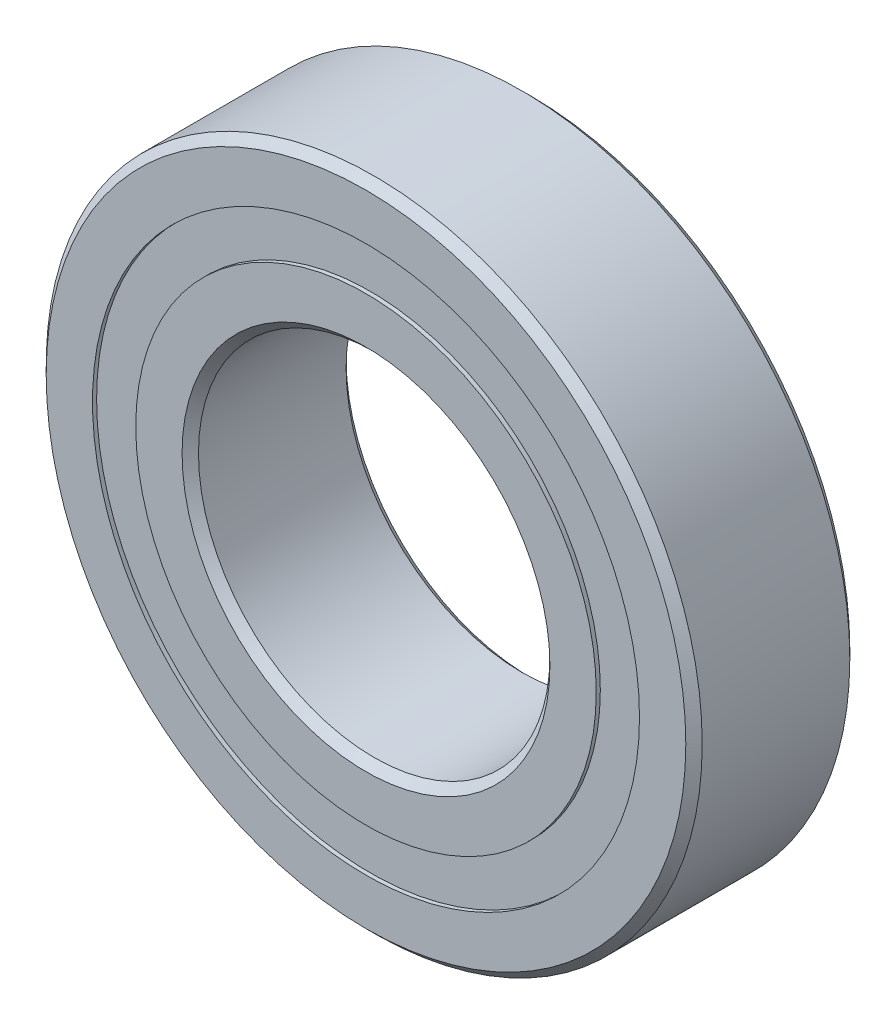
ISO-10303-21;
HEADER;
FILE_DESCRIPTION(('STEP AP214'),'2;1');
FILE_NAME('part.step','',(''),(''),'','','');
FILE_SCHEMA(('AUTOMOTIVE_DESIGN { 1 0 10303 214 1 1 1 1 }'));
ENDSEC;
DATA;
#1=APPLICATION_CONTEXT('core data for automotive mechanical design processes');
#2=APPLICATION_PROTOCOL_DEFINITION('international standard','automotive_design',2000,#1);
#3=PRODUCT_CONTEXT('',#1,'mechanical');
#4=PRODUCT('Part','Part','',(#3));
#5=PRODUCT_RELATED_PRODUCT_CATEGORY('part','',(#4));
#6=PRODUCT_DEFINITION_FORMATION('','',#4);
#7=PRODUCT_DEFINITION_CONTEXT('part definition',#1,'design');
#8=PRODUCT_DEFINITION('design','',#6,#7);
#9=PRODUCT_DEFINITION_SHAPE('','',#8);
#10=(LENGTH_UNIT() NAMED_UNIT(*) SI_UNIT(.MILLI.,.METRE.));
#11=(NAMED_UNIT(*) PLANE_ANGLE_UNIT() SI_UNIT($,.RADIAN.));
#12=(NAMED_UNIT(*) SI_UNIT($,.STERADIAN.) SOLID_ANGLE_UNIT());
#13=UNCERTAINTY_MEASURE_WITH_UNIT(LENGTH_MEASURE(1.E-05),#10,'distance_accuracy_value','');
#14=(GEOMETRIC_REPRESENTATION_CONTEXT(3) GLOBAL_UNCERTAINTY_ASSIGNED_CONTEXT((#13)) GLOBAL_UNIT_ASSIGNED_CONTEXT((#10,
#11,#12)) REPRESENTATION_CONTEXT('',''));
#15=CARTESIAN_POINT('',(0.,0.,0.));
#16=DIRECTION('',(0.,0.,1.));
#17=DIRECTION('',(1.,0.,0.));
#18=AXIS2_PLACEMENT_3D('',#15,#16,#17);
#19=CARTESIAN_POINT('',(-5.37499999999988,9.30977309068279,0.));
#20=DIRECTION('',(0.,0.,1.));
#21=DIRECTION('',(-0.499999999999989,0.866025403784445,0.));
#22=AXIS2_PLACEMENT_3D('',#19,#20,#21);
#23=SPHERICAL_SURFACE('',#22,1.80881842436904);
#24=CARTESIAN_POINT('',(-5.37499999999988,9.30977309068279,1.80881842436904));
#25=VERTEX_POINT('',#24);
#26=VERTEX_LOOP('',#25);
#27=FACE_BOUND('',#26,.T.);
#28=ADVANCED_FACE('F37',(#27),#23,.T.);
#29=CLOSED_SHELL('',(#28));
#30=MANIFOLD_SOLID_BREP('B2',#29);
#31=CARTESIAN_POINT('',(-9.30977309068265,5.37500000000011,0.));
#32=DIRECTION('',(0.,0.,1.));
#33=DIRECTION('',(-0.866025403784433,0.50000000000001,0.));
#34=AXIS2_PLACEMENT_3D('',#31,#32,#33);
#35=SPHERICAL_SURFACE('',#34,1.80881842436904);
#36=CARTESIAN_POINT('',(-9.30977309068265,5.37500000000011,1.80881842436904));
#37=VERTEX_POINT('',#36);
#38=VERTEX_LOOP('',#37);
#39=FACE_BOUND('',#38,.T.);
#40=ADVANCED_FACE('F57',(#39),#35,.T.);
#41=CLOSED_SHELL('',(#40));
#42=MANIFOLD_SOLID_BREP('B6',#41);
#43=CARTESIAN_POINT('',(-10.75,1.12600273177691E-13,0.));
#44=DIRECTION('',(0.,0.,1.));
#45=DIRECTION('',(-1.,0.,0.));
#46=AXIS2_PLACEMENT_3D('',#43,#44,#45);
#47=SPHERICAL_SURFACE('',#46,1.80881842436904);
#48=CARTESIAN_POINT('',(-10.75,1.12600273177691E-13,1.80881842436904));
#49=VERTEX_POINT('',#48);
#50=VERTEX_LOOP('',#49);
#51=FACE_BOUND('',#50,.T.);
#52=ADVANCED_FACE('F77',(#51),#47,.T.);
#53=CLOSED_SHELL('',(#52));
#54=MANIFOLD_SOLID_BREP('B33',#53);
#55=CARTESIAN_POINT('',(-9.30977309068277,-5.37499999999991,0.));
#56=DIRECTION('',(0.,0.,1.));
#57=DIRECTION('',(-0.866025403784443,-0.499999999999992,0.));
#58=AXIS2_PLACEMENT_3D('',#55,#56,#57);
#59=SPHERICAL_SURFACE('',#58,1.80881842436904);
#60=CARTESIAN_POINT('',(-9.30977309068277,-5.37499999999991,1.80881842436904));
#61=VERTEX_POINT('',#60);
#62=VERTEX_LOOP('',#61);
#63=FACE_BOUND('',#62,.T.);
#64=ADVANCED_FACE('F97',(#63),#59,.T.);
#65=CLOSED_SHELL('',(#64));
#66=MANIFOLD_SOLID_BREP('B53',#65);
#67=CARTESIAN_POINT('',(-5.37500000000008,-9.30977309068267,0.));
#68=DIRECTION('',(0.,0.,1.));
#69=DIRECTION('',(-0.500000000000007,-0.866025403784435,0.));
#70=AXIS2_PLACEMENT_3D('',#67,#68,#69);
#71=SPHERICAL_SURFACE('',#70,1.80881842436904);
#72=CARTESIAN_POINT('',(-5.37500000000008,-9.30977309068267,1.80881842436904));
#73=VERTEX_POINT('',#72);
#74=VERTEX_LOOP('',#73);
#75=FACE_BOUND('',#74,.T.);
#76=ADVANCED_FACE('F117',(#75),#71,.T.);
#77=CLOSED_SHELL('',(#76));
#78=MANIFOLD_SOLID_BREP('B73',#77);
#79=CARTESIAN_POINT('',(0.,-10.75,0.));
#80=DIRECTION('',(0.,0.,1.));
#81=DIRECTION('',(0.,-1.,0.));
#82=AXIS2_PLACEMENT_3D('',#79,#80,#81);
#83=SPHERICAL_SURFACE('',#82,1.80881842436904);
#84=CARTESIAN_POINT('',(0.,-10.75,1.80881842436904));
#85=VERTEX_POINT('',#84);
#86=VERTEX_LOOP('',#85);
#87=FACE_BOUND('',#86,.T.);
#88=ADVANCED_FACE('F137',(#87),#83,.T.);
#89=CLOSED_SHELL('',(#88));
#90=MANIFOLD_SOLID_BREP('B93',#89);
#91=CARTESIAN_POINT('',(5.37499999999995,-9.30977309068275,0.));
#92=DIRECTION('',(0.,0.,1.));
#93=DIRECTION('',(0.499999999999995,-0.866025403784442,0.));
#94=AXIS2_PLACEMENT_3D('',#91,#92,#93);
#95=SPHERICAL_SURFACE('',#94,1.80881842436904);
#96=CARTESIAN_POINT('',(5.37499999999995,-9.30977309068275,1.80881842436904));
#97=VERTEX_POINT('',#96);
#98=VERTEX_LOOP('',#97);
#99=FACE_BOUND('',#98,.T.);
#100=ADVANCED_FACE('F157',(#99),#95,.T.);
#101=CLOSED_SHELL('',(#100));
#102=MANIFOLD_SOLID_BREP('B113',#101);
#103=CARTESIAN_POINT('',(9.30977309068269,-5.37500000000005,0.));
#104=DIRECTION('',(0.,0.,1.));
#105=DIRECTION('',(0.866025403784436,-0.500000000000004,0.));
#106=AXIS2_PLACEMENT_3D('',#103,#104,#105);
#107=SPHERICAL_SURFACE('',#106,1.80881842436904);
#108=CARTESIAN_POINT('',(9.30977309068269,-5.37500000000005,1.80881842436904));
#109=VERTEX_POINT('',#108);
#110=VERTEX_LOOP('',#109);
#111=FACE_BOUND('',#110,.T.);
#112=ADVANCED_FACE('F177',(#111),#107,.T.);
#113=CLOSED_SHELL('',(#112));
#114=MANIFOLD_SOLID_BREP('B133',#113);
#115=CARTESIAN_POINT('',(10.75,0.,0.));
#116=DIRECTION('',(0.,0.,1.));
#117=DIRECTION('',(1.,0.,0.));
#118=AXIS2_PLACEMENT_3D('',#115,#116,#117);
#119=SPHERICAL_SURFACE('',#118,1.80881842436904);
#120=CARTESIAN_POINT('',(10.75,0.,1.80881842436904));
#121=VERTEX_POINT('',#120);
#122=VERTEX_LOOP('',#121);
#123=FACE_BOUND('',#122,.T.);
#124=ADVANCED_FACE('F197',(#123),#119,.T.);
#125=CLOSED_SHELL('',(#124));
#126=MANIFOLD_SOLID_BREP('B153',#125);
#127=CARTESIAN_POINT('',(9.30977309068273,5.37499999999998,0.));
#128=DIRECTION('',(0.,0.,1.));
#129=DIRECTION('',(0.86602540378444,0.499999999999998,0.));
#130=AXIS2_PLACEMENT_3D('',#127,#128,#129);
#131=SPHERICAL_SURFACE('',#130,1.80881842436904);
#132=CARTESIAN_POINT('',(9.30977309068273,5.37499999999998,1.80881842436904));
#133=VERTEX_POINT('',#132);
#134=VERTEX_LOOP('',#133);
#135=FACE_BOUND('',#134,.T.);
#136=ADVANCED_FACE('F217',(#135),#131,.T.);
#137=CLOSED_SHELL('',(#136));
#138=MANIFOLD_SOLID_BREP('B173',#137);
#139=CARTESIAN_POINT('',(5.37500000000001,9.30977309068271,0.));
#140=DIRECTION('',(0.,0.,1.));
#141=DIRECTION('',(0.500000000000001,0.866025403784438,0.));
#142=AXIS2_PLACEMENT_3D('',#139,#140,#141);
#143=SPHERICAL_SURFACE('',#142,1.80881842436904);
#144=CARTESIAN_POINT('',(5.37500000000001,9.30977309068271,1.80881842436904));
#145=VERTEX_POINT('',#144);
#146=VERTEX_LOOP('',#145);
#147=FACE_BOUND('',#146,.T.);
#148=ADVANCED_FACE('F237',(#147),#143,.T.);
#149=CLOSED_SHELL('',(#148));
#150=MANIFOLD_SOLID_BREP('B193',#149);
#151=CARTESIAN_POINT('',(0.,10.75,0.));
#152=DIRECTION('',(0.,0.,1.));
#153=DIRECTION('',(0.,1.,0.));
#154=AXIS2_PLACEMENT_3D('',#151,#152,#153);
#155=SPHERICAL_SURFACE('',#154,1.80881842436904);
#156=CARTESIAN_POINT('',(0.,10.75,1.80881842436904));
#157=VERTEX_POINT('',#156);
#158=VERTEX_LOOP('',#157);
#159=FACE_BOUND('',#158,.T.);
#160=ADVANCED_FACE('F258',(#159),#155,.T.);
#161=CLOSED_SHELL('',(#160));
#162=MANIFOLD_SOLID_BREP('B213',#161);
#163=CARTESIAN_POINT('',(0.,0.,3.5));
#164=DIRECTION('',(0.,0.,1.));
#165=DIRECTION('',(1.,0.,0.));
#166=AXIS2_PLACEMENT_3D('',#163,#164,#165);
#167=CYLINDRICAL_SURFACE('',#166,11.6730769230769);
#168=CARTESIAN_POINT('',(0.,0.,-3.5));
#169=DIRECTION('',(0.,0.,1.));
#170=DIRECTION('',(1.,0.,0.));
#171=AXIS2_PLACEMENT_3D('',#168,#169,#170);
#172=CIRCLE('',#171,11.6730769230769);
#173=CARTESIAN_POINT('',(11.6730769230769,0.,-3.5));
#174=VERTEX_POINT('',#173);
#175=EDGE_CURVE('E310',#174,#174,#172,.T.);
#176=ORIENTED_EDGE('',*,*,#175,.F.);
#177=EDGE_LOOP('',(#176));
#178=FACE_BOUND('',#177,.T.);
#179=CARTESIAN_POINT('',(0.,0.,-3.32499999999999));
#180=DIRECTION('',(0.,0.,1.));
#181=DIRECTION('',(1.,0.,0.));
#182=AXIS2_PLACEMENT_3D('',#179,#180,#181);
#183=CIRCLE('',#182,11.6730769230769);
#184=CARTESIAN_POINT('',(11.6730769230769,0.,-3.32499999999999));
#185=VERTEX_POINT('',#184);
#186=EDGE_CURVE('E257',#185,#185,#183,.F.);
#187=ORIENTED_EDGE('',*,*,#186,.F.);
#188=EDGE_LOOP('',(#187));
#189=FACE_BOUND('',#188,.T.);
#190=ADVANCED_FACE('F271',(#178,#189),#167,.F.);
#191=CARTESIAN_POINT('',(0.,0.,3.5));
#192=DIRECTION('',(0.,0.,1.));
#193=DIRECTION('',(1.,0.,0.));
#194=AXIS2_PLACEMENT_3D('',#191,#192,#193);
#195=CYLINDRICAL_SURFACE('',#194,9.82692307692308);
#196=CARTESIAN_POINT('',(0.,0.,-3.5));
#197=DIRECTION('',(0.,0.,1.));
#198=DIRECTION('',(1.,0.,0.));
#199=AXIS2_PLACEMENT_3D('',#196,#197,#198);
#200=CIRCLE('',#199,9.82692307692308);
#201=CARTESIAN_POINT('',(9.82692307692308,0.,-3.5));
#202=VERTEX_POINT('',#201);
#203=EDGE_CURVE('E337',#202,#202,#200,.T.);
#204=ORIENTED_EDGE('',*,*,#203,.T.);
#205=EDGE_LOOP('',(#204));
#206=FACE_BOUND('',#205,.T.);
#207=CARTESIAN_POINT('',(0.,0.,-3.32499999999999));
#208=DIRECTION('',(0.,0.,1.));
#209=DIRECTION('',(1.,0.,0.));
#210=AXIS2_PLACEMENT_3D('',#207,#208,#209);
#211=CIRCLE('',#210,9.82692307692308);
#212=CARTESIAN_POINT('',(9.82692307692308,0.,-3.32499999999999));
#213=VERTEX_POINT('',#212);
#214=EDGE_CURVE('E283',#213,#213,#211,.T.);
#215=ORIENTED_EDGE('',*,*,#214,.F.);
#216=EDGE_LOOP('',(#215));
#217=FACE_BOUND('',#216,.T.);
#218=ADVANCED_FACE('F379',(#206,#217),#195,.T.);
#219=CARTESIAN_POINT('',(0.,0.,3.5));
#220=DIRECTION('',(0.,0.,1.));
#221=DIRECTION('',(1.,0.,0.));
#222=AXIS2_PLACEMENT_3D('',#219,#220,#221);
#223=CYLINDRICAL_SURFACE('',#222,11.6730769230769);
#224=CARTESIAN_POINT('',(0.,0.,3.5));
#225=DIRECTION('',(0.,0.,1.));
#226=DIRECTION('',(1.,0.,0.));
#227=AXIS2_PLACEMENT_3D('',#224,#225,#226);
#228=CIRCLE('',#227,11.6730769230769);
#229=CARTESIAN_POINT('',(11.6730769230769,0.,3.5));
#230=VERTEX_POINT('',#229);
#231=EDGE_CURVE('E301',#230,#230,#228,.T.);
#232=ORIENTED_EDGE('',*,*,#231,.T.);
#233=EDGE_LOOP('',(#232));
#234=FACE_BOUND('',#233,.T.);
#235=CARTESIAN_POINT('',(0.,0.,3.32499999999999));
#236=DIRECTION('',(0.,0.,-1.));
#237=DIRECTION('',(-1.,0.,0.));
#238=AXIS2_PLACEMENT_3D('',#235,#236,#237);
#239=CIRCLE('',#238,11.6730769230769);
#240=CARTESIAN_POINT('',(-11.6730769230769,0.,3.32499999999999));
#241=VERTEX_POINT('',#240);
#242=EDGE_CURVE('E292',#241,#241,#239,.F.);
#243=ORIENTED_EDGE('',*,*,#242,.F.);
#244=EDGE_LOOP('',(#243));
#245=FACE_BOUND('',#244,.T.);
#246=ADVANCED_FACE('F377',(#234,#245),#223,.F.);
#247=CARTESIAN_POINT('',(0.,0.,3.15));
#248=DIRECTION('',(0.,0.,-1.));
#249=DIRECTION('',(-1.,0.,0.));
#250=AXIS2_PLACEMENT_3D('',#247,#248,#249);
#251=CONICAL_SURFACE('',#250,14.,0.78539816339744);
#252=CARTESIAN_POINT('',(0.,0.,3.5));
#253=DIRECTION('',(0.,0.,1.));
#254=DIRECTION('',(1.,0.,0.));
#255=AXIS2_PLACEMENT_3D('',#252,#253,#254);
#256=CIRCLE('',#255,13.65);
#257=CARTESIAN_POINT('',(13.65,0.,3.5));
#258=VERTEX_POINT('',#257);
#259=EDGE_CURVE('E298',#258,#258,#256,.T.);
#260=ORIENTED_EDGE('',*,*,#259,.F.);
#261=EDGE_LOOP('',(#260));
#262=FACE_BOUND('',#261,.T.);
#263=CARTESIAN_POINT('',(0.,0.,3.15));
#264=DIRECTION('',(0.,0.,1.));
#265=DIRECTION('',(1.,0.,0.));
#266=AXIS2_PLACEMENT_3D('',#263,#264,#265);
#267=CIRCLE('',#266,14.);
#268=CARTESIAN_POINT('',(14.,0.,3.15));
#269=VERTEX_POINT('',#268);
#270=EDGE_CURVE('E319',#269,#269,#267,.T.);
#271=ORIENTED_EDGE('',*,*,#270,.T.);
#272=EDGE_LOOP('',(#271));
#273=FACE_BOUND('',#272,.T.);
#274=ADVANCED_FACE('F273',(#262,#273),#251,.T.);
#275=CARTESIAN_POINT('',(0.,13.65,3.5));
#276=DIRECTION('',(0.,0.,-1.));
#277=DIRECTION('',(-1.,0.,0.));
#278=AXIS2_PLACEMENT_3D('',#275,#276,#277);
#279=PLANE('',#278);
#280=ORIENTED_EDGE('',*,*,#231,.F.);
#281=EDGE_LOOP('',(#280));
#282=FACE_BOUND('',#281,.T.);
#283=ORIENTED_EDGE('',*,*,#259,.T.);
#284=EDGE_LOOP('',(#283));
#285=FACE_BOUND('',#284,.T.);
#286=ADVANCED_FACE('F387',(#282,#285),#279,.F.);
#287=CARTESIAN_POINT('',(0.,13.65,-3.5));
#288=DIRECTION('',(0.,0.,1.));
#289=DIRECTION('',(1.,0.,0.));
#290=AXIS2_PLACEMENT_3D('',#287,#288,#289);
#291=PLANE('',#290);
#292=CARTESIAN_POINT('',(0.,0.,-3.5));
#293=DIRECTION('',(0.,0.,1.));
#294=DIRECTION('',(1.,0.,0.));
#295=AXIS2_PLACEMENT_3D('',#292,#293,#294);
#296=CIRCLE('',#295,13.65);
#297=CARTESIAN_POINT('',(13.65,0.,-3.5));
#298=VERTEX_POINT('',#297);
#299=EDGE_CURVE('E313',#298,#298,#296,.T.);
#300=ORIENTED_EDGE('',*,*,#299,.F.);
#301=EDGE_LOOP('',(#300));
#302=FACE_BOUND('',#301,.T.);
#303=ORIENTED_EDGE('',*,*,#175,.T.);
#304=EDGE_LOOP('',(#303));
#305=FACE_BOUND('',#304,.T.);
#306=ADVANCED_FACE('F449',(#302,#305),#291,.F.);
#307=CARTESIAN_POINT('',(0.,0.,-3.5));
#308=DIRECTION('',(0.,0.,1.));
#309=DIRECTION('',(1.,0.,0.));
#310=AXIS2_PLACEMENT_3D('',#307,#308,#309);
#311=CONICAL_SURFACE('',#310,13.65,0.78539816339745);
#312=CARTESIAN_POINT('',(0.,0.,-3.15));
#313=DIRECTION('',(0.,0.,1.));
#314=DIRECTION('',(1.,0.,0.));
#315=AXIS2_PLACEMENT_3D('',#312,#313,#314);
#316=CIRCLE('',#315,14.);
#317=CARTESIAN_POINT('',(14.,0.,-3.15));
#318=VERTEX_POINT('',#317);
#319=EDGE_CURVE('E316',#318,#318,#316,.T.);
#320=ORIENTED_EDGE('',*,*,#319,.F.);
#321=EDGE_LOOP('',(#320));
#322=FACE_BOUND('',#321,.T.);
#323=ORIENTED_EDGE('',*,*,#299,.T.);
#324=EDGE_LOOP('',(#323));
#325=FACE_BOUND('',#324,.T.);
#326=ADVANCED_FACE('F446',(#322,#325),#311,.T.);
#327=CARTESIAN_POINT('',(0.,0.,3.5));
#328=DIRECTION('',(0.,0.,1.));
#329=DIRECTION('',(1.,0.,0.));
#330=AXIS2_PLACEMENT_3D('',#327,#328,#329);
#331=CYLINDRICAL_SURFACE('',#330,14.);
#332=ORIENTED_EDGE('',*,*,#270,.F.);
#333=EDGE_LOOP('',(#332));
#334=FACE_BOUND('',#333,.T.);
#335=ORIENTED_EDGE('',*,*,#319,.T.);
#336=EDGE_LOOP('',(#335));
#337=FACE_BOUND('',#336,.T.);
#338=ADVANCED_FACE('F373',(#334,#337),#331,.T.);
#339=CARTESIAN_POINT('',(0.,11.6730769230769,3.32499999999999));
#340=DIRECTION('',(0.,0.,-1.));
#341=DIRECTION('',(-1.,0.,0.));
#342=AXIS2_PLACEMENT_3D('',#339,#340,#341);
#343=PLANE('',#342);
#344=CARTESIAN_POINT('',(0.,0.,3.32499999999999));
#345=DIRECTION('',(0.,0.,1.));
#346=DIRECTION('',(1.,0.,0.));
#347=AXIS2_PLACEMENT_3D('',#344,#345,#346);
#348=CIRCLE('',#347,9.82692307692308);
#349=CARTESIAN_POINT('',(9.82692307692308,0.,3.32499999999999));
#350=VERTEX_POINT('',#349);
#351=EDGE_CURVE('E322',#350,#350,#348,.T.);
#352=ORIENTED_EDGE('',*,*,#351,.F.);
#353=EDGE_LOOP('',(#352));
#354=FACE_BOUND('',#353,.T.);
#355=ORIENTED_EDGE('',*,*,#242,.T.);
#356=EDGE_LOOP('',(#355));
#357=FACE_BOUND('',#356,.T.);
#358=ADVANCED_FACE('F366',(#354,#357),#343,.F.);
#359=CARTESIAN_POINT('',(0.,0.,3.5));
#360=DIRECTION('',(0.,0.,1.));
#361=DIRECTION('',(1.,0.,0.));
#362=AXIS2_PLACEMENT_3D('',#359,#360,#361);
#363=CYLINDRICAL_SURFACE('',#362,9.82692307692308);
#364=CARTESIAN_POINT('',(0.,0.,3.5));
#365=DIRECTION('',(0.,0.,1.));
#366=DIRECTION('',(1.,0.,0.));
#367=AXIS2_PLACEMENT_3D('',#364,#365,#366);
#368=CIRCLE('',#367,9.82692307692308);
#369=CARTESIAN_POINT('',(9.82692307692308,0.,3.5));
#370=VERTEX_POINT('',#369);
#371=EDGE_CURVE('E346',#370,#370,#368,.T.);
#372=ORIENTED_EDGE('',*,*,#371,.F.);
#373=EDGE_LOOP('',(#372));
#374=FACE_BOUND('',#373,.T.);
#375=ORIENTED_EDGE('',*,*,#351,.T.);
#376=EDGE_LOOP('',(#375));
#377=FACE_BOUND('',#376,.T.);
#378=ADVANCED_FACE('F363',(#374,#377),#363,.T.);
#379=CARTESIAN_POINT('',(0.,0.,3.5));
#380=DIRECTION('',(0.,0.,1.));
#381=DIRECTION('',(1.,0.,0.));
#382=AXIS2_PLACEMENT_3D('',#379,#380,#381);
#383=CONICAL_SURFACE('',#382,7.85000000000001,0.785398163397452);
#384=CARTESIAN_POINT('',(0.,0.,3.15));
#385=DIRECTION('',(0.,0.,1.));
#386=DIRECTION('',(1.,0.,0.));
#387=AXIS2_PLACEMENT_3D('',#384,#385,#386);
#388=CIRCLE('',#387,7.50000000000001);
#389=CARTESIAN_POINT('',(7.50000000000001,0.,3.15));
#390=VERTEX_POINT('',#389);
#391=EDGE_CURVE('E328',#390,#390,#388,.T.);
#392=ORIENTED_EDGE('',*,*,#391,.F.);
#393=EDGE_LOOP('',(#392));
#394=FACE_BOUND('',#393,.T.);
#395=CARTESIAN_POINT('',(0.,0.,3.5));
#396=DIRECTION('',(0.,0.,1.));
#397=DIRECTION('',(1.,0.,0.));
#398=AXIS2_PLACEMENT_3D('',#395,#396,#397);
#399=CIRCLE('',#398,7.85000000000001);
#400=CARTESIAN_POINT('',(7.85000000000001,0.,3.5));
#401=VERTEX_POINT('',#400);
#402=EDGE_CURVE('E349',#401,#401,#399,.T.);
#403=ORIENTED_EDGE('',*,*,#402,.T.);
#404=EDGE_LOOP('',(#403));
#405=FACE_BOUND('',#404,.T.);
#406=ADVANCED_FACE('F353',(#394,#405),#383,.F.);
#407=CARTESIAN_POINT('',(0.,0.,3.5));
#408=DIRECTION('',(0.,0.,1.));
#409=DIRECTION('',(1.,0.,0.));
#410=AXIS2_PLACEMENT_3D('',#407,#408,#409);
#411=CYLINDRICAL_SURFACE('',#410,7.50000000000001);
#412=CARTESIAN_POINT('',(0.,0.,-3.15));
#413=DIRECTION('',(0.,0.,1.));
#414=DIRECTION('',(1.,0.,0.));
#415=AXIS2_PLACEMENT_3D('',#412,#413,#414);
#416=CIRCLE('',#415,7.50000000000001);
#417=CARTESIAN_POINT('',(7.50000000000001,0.,-3.15));
#418=VERTEX_POINT('',#417);
#419=EDGE_CURVE('E331',#418,#418,#416,.T.);
#420=ORIENTED_EDGE('',*,*,#419,.F.);
#421=EDGE_LOOP('',(#420));
#422=FACE_BOUND('',#421,.T.);
#423=ORIENTED_EDGE('',*,*,#391,.T.);
#424=EDGE_LOOP('',(#423));
#425=FACE_BOUND('',#424,.T.);
#426=ADVANCED_FACE('F436',(#422,#425),#411,.F.);
#427=CARTESIAN_POINT('',(0.,0.,-3.15));
#428=DIRECTION('',(0.,0.,-1.));
#429=DIRECTION('',(-1.,0.,0.));
#430=AXIS2_PLACEMENT_3D('',#427,#428,#429);
#431=CONICAL_SURFACE('',#430,7.50000000000001,0.785398163397452);
#432=CARTESIAN_POINT('',(0.,0.,-3.5));
#433=DIRECTION('',(0.,0.,1.));
#434=DIRECTION('',(1.,0.,0.));
#435=AXIS2_PLACEMENT_3D('',#432,#433,#434);
#436=CIRCLE('',#435,7.85000000000001);
#437=CARTESIAN_POINT('',(7.85000000000001,0.,-3.5));
#438=VERTEX_POINT('',#437);
#439=EDGE_CURVE('E334',#438,#438,#436,.T.);
#440=ORIENTED_EDGE('',*,*,#439,.F.);
#441=EDGE_LOOP('',(#440));
#442=FACE_BOUND('',#441,.T.);
#443=ORIENTED_EDGE('',*,*,#419,.T.);
#444=EDGE_LOOP('',(#443));
#445=FACE_BOUND('',#444,.T.);
#446=ADVANCED_FACE('F432',(#442,#445),#431,.F.);
#447=CARTESIAN_POINT('',(0.,7.85000000000001,-3.5));
#448=DIRECTION('',(0.,0.,1.));
#449=DIRECTION('',(1.,0.,0.));
#450=AXIS2_PLACEMENT_3D('',#447,#448,#449);
#451=PLANE('',#450);
#452=ORIENTED_EDGE('',*,*,#203,.F.);
#453=EDGE_LOOP('',(#452));
#454=FACE_BOUND('',#453,.T.);
#455=ORIENTED_EDGE('',*,*,#439,.T.);
#456=EDGE_LOOP('',(#455));
#457=FACE_BOUND('',#456,.T.);
#458=ADVANCED_FACE('F359',(#454,#457),#451,.F.);
#459=CARTESIAN_POINT('',(0.,7.85000000000001,3.5));
#460=DIRECTION('',(0.,0.,-1.));
#461=DIRECTION('',(-1.,0.,0.));
#462=AXIS2_PLACEMENT_3D('',#459,#460,#461);
#463=PLANE('',#462);
#464=ORIENTED_EDGE('',*,*,#402,.F.);
#465=EDGE_LOOP('',(#464));
#466=FACE_BOUND('',#465,.T.);
#467=ORIENTED_EDGE('',*,*,#371,.T.);
#468=EDGE_LOOP('',(#467));
#469=FACE_BOUND('',#468,.T.);
#470=ADVANCED_FACE('F355',(#466,#469),#463,.F.);
#471=CARTESIAN_POINT('',(0.,11.6730769230769,-3.32499999999999));
#472=DIRECTION('',(0.,0.,1.));
#473=DIRECTION('',(1.,0.,0.));
#474=AXIS2_PLACEMENT_3D('',#471,#472,#473);
#475=PLANE('',#474);
#476=ORIENTED_EDGE('',*,*,#186,.T.);
#477=EDGE_LOOP('',(#476));
#478=FACE_BOUND('',#477,.T.);
#479=ORIENTED_EDGE('',*,*,#214,.T.);
#480=EDGE_LOOP('',(#479));
#481=FACE_BOUND('',#480,.T.);
#482=ADVANCED_FACE('F358',(#478,#481),#475,.F.);
#483=CLOSED_SHELL('',(#190,#218,#246,#274,#286,#306,#326,#338,#358,#378,#406,#426,#446,#458,
#470,#482));
#484=CARTESIAN_POINT('',(0.,11.6730769230769,-1.80881842436905));
#485=DIRECTION('',(0.,0.,-1.));
#486=DIRECTION('',(-1.,0.,0.));
#487=AXIS2_PLACEMENT_3D('',#484,#485,#486);
#488=PLANE('',#487);
#489=CARTESIAN_POINT('',(0.,0.,-1.80881842436905));
#490=DIRECTION('',(0.,0.,-1.));
#491=DIRECTION('',(-1.,0.,0.));
#492=AXIS2_PLACEMENT_3D('',#489,#490,#491);
#493=CIRCLE('',#492,9.82692307692308);
#494=CARTESIAN_POINT('',(-9.82692307692308,0.,-1.80881842436905));
#495=VERTEX_POINT('',#494);
#496=EDGE_CURVE('E287',#495,#495,#493,.T.);
#497=ORIENTED_EDGE('',*,*,#496,.T.);
#498=EDGE_LOOP('',(#497));
#499=FACE_BOUND('',#498,.T.);
#500=CARTESIAN_POINT('',(0.,0.,-1.80881842436905));
#501=DIRECTION('',(0.,0.,-1.));
#502=DIRECTION('',(-1.,0.,0.));
#503=AXIS2_PLACEMENT_3D('',#500,#501,#502);
#504=CIRCLE('',#503,11.6730769230769);
#505=CARTESIAN_POINT('',(-11.6730769230769,0.,-1.80881842436905));
#506=VERTEX_POINT('',#505);
#507=EDGE_CURVE('E279',#506,#506,#504,.F.);
#508=ORIENTED_EDGE('',*,*,#507,.T.);
#509=EDGE_LOOP('',(#508));
#510=FACE_BOUND('',#509,.T.);
#511=ADVANCED_FACE('F395',(#499,#510),#488,.F.);
#512=CARTESIAN_POINT('',(0.,0.,1.55555555555556));
#513=DIRECTION('',(0.,0.,1.));
#514=DIRECTION('',(1.,0.,0.));
#515=AXIS2_PLACEMENT_3D('',#512,#513,#514);
#516=CIRCLE('',#515,11.6730769230769);
#517=CARTESIAN_POINT('',(11.6730769230769,0.,1.55555555555556));
#518=VERTEX_POINT('',#517);
#519=EDGE_CURVE('E304',#518,#518,#516,.T.);
#520=ORIENTED_EDGE('',*,*,#519,.F.);
#521=EDGE_LOOP('',(#520));
#522=FACE_BOUND('',#521,.T.);
#523=CARTESIAN_POINT('',(0.,0.,1.80881842436904));
#524=DIRECTION('',(0.,0.,1.));
#525=DIRECTION('',(1.,0.,0.));
#526=AXIS2_PLACEMENT_3D('',#523,#524,#525);
#527=CIRCLE('',#526,11.6730769230769);
#528=CARTESIAN_POINT('',(11.6730769230769,0.,1.80881842436904));
#529=VERTEX_POINT('',#528);
#530=EDGE_CURVE('E295',#529,#529,#527,.F.);
#531=ORIENTED_EDGE('',*,*,#530,.F.);
#532=EDGE_LOOP('',(#531));
#533=FACE_BOUND('',#532,.T.);
#534=ADVANCED_FACE('F382',(#522,#533),#223,.F.);
#535=CARTESIAN_POINT('',(0.,0.,0.));
#536=DIRECTION('',(0.,0.,1.));
#537=DIRECTION('',(1.,0.,0.));
#538=AXIS2_PLACEMENT_3D('',#535,#536,#537);
#539=TOROIDAL_SURFACE('',#538,10.75,1.80881842436904);
#540=CARTESIAN_POINT('',(0.,0.,-1.55555555555556));
#541=DIRECTION('',(0.,0.,1.));
#542=DIRECTION('',(1.,0.,0.));
#543=AXIS2_PLACEMENT_3D('',#540,#541,#542);
#544=CIRCLE('',#543,11.6730769230769);
#545=CARTESIAN_POINT('',(11.6730769230769,0.,-1.55555555555556));
#546=VERTEX_POINT('',#545);
#547=EDGE_CURVE('E307',#546,#546,#544,.T.);
#548=ORIENTED_EDGE('',*,*,#547,.F.);
#549=EDGE_LOOP('',(#548));
#550=FACE_BOUND('',#549,.T.);
#551=ORIENTED_EDGE('',*,*,#519,.T.);
#552=EDGE_LOOP('',(#551));
#553=FACE_BOUND('',#552,.T.);
#554=ADVANCED_FACE('F394',(#550,#553),#539,.F.);
#555=ORIENTED_EDGE('',*,*,#547,.T.);
#556=EDGE_LOOP('',(#555));
#557=FACE_BOUND('',#556,.T.);
#558=ORIENTED_EDGE('',*,*,#507,.F.);
#559=EDGE_LOOP('',(#558));
#560=FACE_BOUND('',#559,.T.);
#561=ADVANCED_FACE('F401',(#557,#560),#167,.F.);
#562=CARTESIAN_POINT('',(0.,11.6730769230769,1.80881842436904));
#563=DIRECTION('',(0.,0.,1.));
#564=DIRECTION('',(1.,0.,0.));
#565=AXIS2_PLACEMENT_3D('',#562,#563,#564);
#566=PLANE('',#565);
#567=ORIENTED_EDGE('',*,*,#530,.T.);
#568=EDGE_LOOP('',(#567));
#569=FACE_BOUND('',#568,.T.);
#570=CARTESIAN_POINT('',(0.,0.,1.80881842436904));
#571=DIRECTION('',(0.,0.,1.));
#572=DIRECTION('',(1.,0.,0.));
#573=AXIS2_PLACEMENT_3D('',#570,#571,#572);
#574=CIRCLE('',#573,9.82692307692308);
#575=CARTESIAN_POINT('',(9.82692307692308,0.,1.80881842436904));
#576=VERTEX_POINT('',#575);
#577=EDGE_CURVE('E325',#576,#576,#574,.F.);
#578=ORIENTED_EDGE('',*,*,#577,.F.);
#579=EDGE_LOOP('',(#578));
#580=FACE_BOUND('',#579,.T.);
#581=ADVANCED_FACE('F408',(#569,#580),#566,.F.);
#582=CARTESIAN_POINT('',(0.,0.,1.55555555555556));
#583=DIRECTION('',(0.,0.,1.));
#584=DIRECTION('',(1.,0.,0.));
#585=AXIS2_PLACEMENT_3D('',#582,#583,#584);
#586=CIRCLE('',#585,9.82692307692308);
#587=CARTESIAN_POINT('',(9.82692307692308,0.,1.55555555555556));
#588=VERTEX_POINT('',#587);
#589=EDGE_CURVE('E343',#588,#588,#586,.T.);
#590=ORIENTED_EDGE('',*,*,#589,.T.);
#591=EDGE_LOOP('',(#590));
#592=FACE_BOUND('',#591,.T.);
#593=ORIENTED_EDGE('',*,*,#577,.T.);
#594=EDGE_LOOP('',(#593));
#595=FACE_BOUND('',#594,.T.);
#596=ADVANCED_FACE('F368',(#592,#595),#363,.T.);
#597=CARTESIAN_POINT('',(0.,0.,0.));
#598=DIRECTION('',(0.,0.,1.));
#599=DIRECTION('',(1.,0.,0.));
#600=AXIS2_PLACEMENT_3D('',#597,#598,#599);
#601=TOROIDAL_SURFACE('',#600,10.75,1.80881842436904);
#602=ORIENTED_EDGE('',*,*,#589,.F.);
#603=EDGE_LOOP('',(#602));
#604=FACE_BOUND('',#603,.T.);
#605=CARTESIAN_POINT('',(0.,0.,-1.55555555555556));
#606=DIRECTION('',(0.,0.,1.));
#607=DIRECTION('',(1.,0.,0.));
#608=AXIS2_PLACEMENT_3D('',#605,#606,#607);
#609=CIRCLE('',#608,9.82692307692308);
#610=CARTESIAN_POINT('',(9.82692307692308,0.,-1.55555555555556));
#611=VERTEX_POINT('',#610);
#612=EDGE_CURVE('E340',#611,#611,#609,.T.);
#613=ORIENTED_EDGE('',*,*,#612,.T.);
#614=EDGE_LOOP('',(#613));
#615=FACE_BOUND('',#614,.T.);
#616=ADVANCED_FACE('F426',(#604,#615),#601,.F.);
#617=ORIENTED_EDGE('',*,*,#612,.F.);
#618=EDGE_LOOP('',(#617));
#619=FACE_BOUND('',#618,.T.);
#620=ORIENTED_EDGE('',*,*,#496,.F.);
#621=EDGE_LOOP('',(#620));
#622=FACE_BOUND('',#621,.T.);
#623=ADVANCED_FACE('F391',(#619,#622),#195,.T.);
#624=CLOSED_SHELL('',(#511,#534,#554,#561,#581,#596,#616,#623));
#625=ORIENTED_CLOSED_SHELL('',*,#624,.T.);
#626=BREP_WITH_VOIDS('B233',#483,(#625));
#627=ADVANCED_BREP_SHAPE_REPRESENTATION('',(#18,#30,#42,#54,#66,#78,#90,#102,#114,#126,#138,
#150,#162,#626),#14);
#628=SHAPE_DEFINITION_REPRESENTATION(#9,#627);
ENDSEC;
END-ISO-10303-21;
